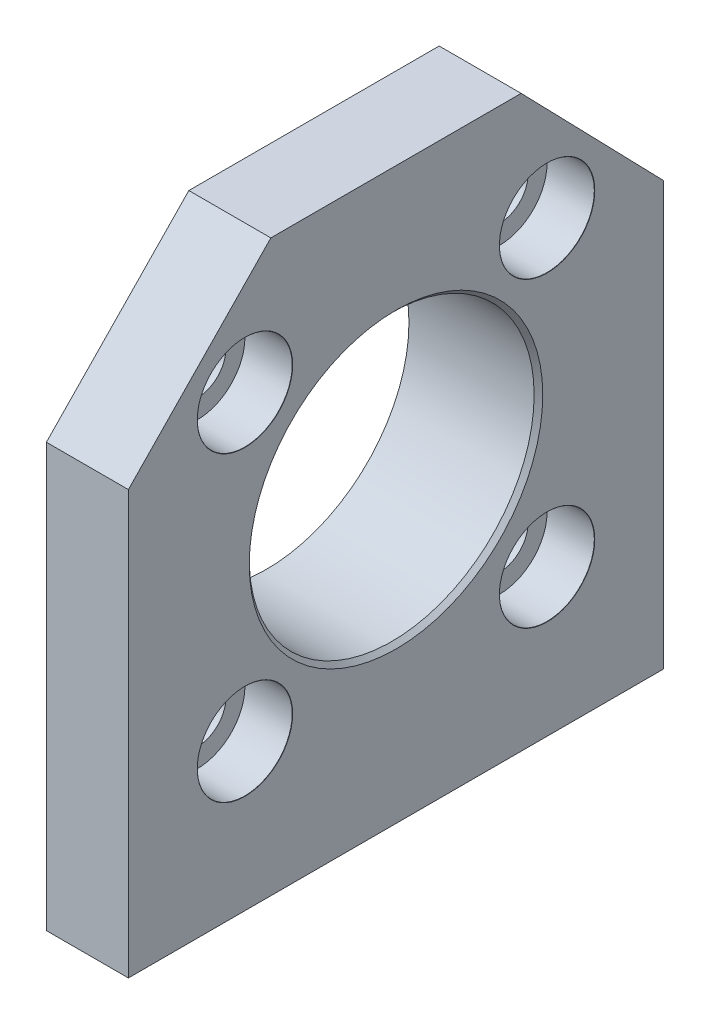
ISO-10303-21;
HEADER;
FILE_DESCRIPTION(('STEP AP214'),'2;1');
FILE_NAME('part.step','',(''),(''),'','','');
FILE_SCHEMA(('AUTOMOTIVE_DESIGN { 1 0 10303 214 1 1 1 1 }'));
ENDSEC;
DATA;
#1=APPLICATION_CONTEXT('core data for automotive mechanical design processes');
#2=APPLICATION_PROTOCOL_DEFINITION('international standard','automotive_design',2000,#1);
#3=PRODUCT_CONTEXT('',#1,'mechanical');
#4=PRODUCT('Part','Part','',(#3));
#5=PRODUCT_RELATED_PRODUCT_CATEGORY('part','',(#4));
#6=PRODUCT_DEFINITION_FORMATION('','',#4);
#7=PRODUCT_DEFINITION_CONTEXT('part definition',#1,'design');
#8=PRODUCT_DEFINITION('design','',#6,#7);
#9=PRODUCT_DEFINITION_SHAPE('','',#8);
#10=(LENGTH_UNIT() NAMED_UNIT(*) SI_UNIT(.MILLI.,.METRE.));
#11=(NAMED_UNIT(*) PLANE_ANGLE_UNIT() SI_UNIT($,.RADIAN.));
#12=(NAMED_UNIT(*) SI_UNIT($,.STERADIAN.) SOLID_ANGLE_UNIT());
#13=UNCERTAINTY_MEASURE_WITH_UNIT(LENGTH_MEASURE(1.E-05),#10,'distance_accuracy_value','');
#14=(GEOMETRIC_REPRESENTATION_CONTEXT(3) GLOBAL_UNCERTAINTY_ASSIGNED_CONTEXT((#13)) GLOBAL_UNIT_ASSIGNED_CONTEXT((#10,
#11,#12)) REPRESENTATION_CONTEXT('',''));
#15=CARTESIAN_POINT('',(0.,0.,0.));
#16=DIRECTION('',(0.,0.,1.));
#17=DIRECTION('',(1.,0.,0.));
#18=AXIS2_PLACEMENT_3D('',#15,#16,#17);
#19=CARTESIAN_POINT('',(-9.5,23.7688195991091,24.4890868596882));
#20=DIRECTION('',(0.,-0.69647537716866,-0.717580691628316));
#21=DIRECTION('',(0.,0.717580691628316,-0.69647537716866));
#22=AXIS2_PLACEMENT_3D('',#19,#20,#21);
#23=PLANE('',#22);
#24=DIRECTION('',(0.,0.717580691628316,-0.69647537716866));
#25=VECTOR('',#24,1.);
#26=CARTESIAN_POINT('',(0.,23.7688195991091,24.4890868596882));
#27=LINE('',#26,#25);
#28=CARTESIAN_POINT('',(0.,49.,0.));
#29=VERTEX_POINT('',#28);
#30=CARTESIAN_POINT('',(0.,66.,-16.5));
#31=VERTEX_POINT('',#30);
#32=EDGE_CURVE('E135',#29,#31,#27,.T.);
#33=ORIENTED_EDGE('',*,*,#32,.T.);
#34=DIRECTION('',(1.,0.,0.));
#35=VECTOR('',#34,1.);
#36=CARTESIAN_POINT('',(-9.5,66.,-16.5));
#37=LINE('',#36,#35);
#38=CARTESIAN_POINT('',(-9.5,66.,-16.5));
#39=VERTEX_POINT('',#38);
#40=EDGE_CURVE('E155',#39,#31,#37,.T.);
#41=ORIENTED_EDGE('',*,*,#40,.F.);
#42=DIRECTION('',(0.,0.717580691628316,-0.69647537716866));
#43=VECTOR('',#42,1.);
#44=CARTESIAN_POINT('',(-9.5,23.7688195991091,24.4890868596882));
#45=LINE('',#44,#43);
#46=CARTESIAN_POINT('',(-9.5,49.,0.));
#47=VERTEX_POINT('',#46);
#48=EDGE_CURVE('E154',#47,#39,#45,.T.);
#49=ORIENTED_EDGE('',*,*,#48,.F.);
#50=DIRECTION('',(1.,0.,0.));
#51=VECTOR('',#50,1.);
#52=CARTESIAN_POINT('',(-9.5,49.,0.));
#53=LINE('',#52,#51);
#54=EDGE_CURVE('E134',#47,#29,#53,.T.);
#55=ORIENTED_EDGE('',*,*,#54,.T.);
#56=EDGE_LOOP('',(#33,#41,#49,#55));
#57=FACE_BOUND('',#56,.T.);
#58=ADVANCED_FACE('F43',(#57),#23,.F.);
#59=CARTESIAN_POINT('',(-9.5,66.,0.));
#60=DIRECTION('',(0.,-1.,0.));
#61=DIRECTION('',(0.,0.,-1.));
#62=AXIS2_PLACEMENT_3D('',#59,#60,#61);
#63=PLANE('',#62);
#64=DIRECTION('',(0.,0.,-1.));
#65=VECTOR('',#64,1.);
#66=CARTESIAN_POINT('',(0.,66.,0.));
#67=LINE('',#66,#65);
#68=CARTESIAN_POINT('',(0.,66.,-45.5));
#69=VERTEX_POINT('',#68);
#70=EDGE_CURVE('E82',#31,#69,#67,.T.);
#71=ORIENTED_EDGE('',*,*,#70,.T.);
#72=DIRECTION('',(1.,0.,0.));
#73=VECTOR('',#72,1.);
#74=CARTESIAN_POINT('',(-9.5,66.,-45.5));
#75=LINE('',#74,#73);
#76=CARTESIAN_POINT('',(-9.5,66.,-45.5));
#77=VERTEX_POINT('',#76);
#78=EDGE_CURVE('E121',#77,#69,#75,.T.);
#79=ORIENTED_EDGE('',*,*,#78,.F.);
#80=DIRECTION('',(0.,0.,-1.));
#81=VECTOR('',#80,1.);
#82=CARTESIAN_POINT('',(-9.5,66.,0.));
#83=LINE('',#82,#81);
#84=EDGE_CURVE('E62',#39,#77,#83,.T.);
#85=ORIENTED_EDGE('',*,*,#84,.F.);
#86=ORIENTED_EDGE('',*,*,#40,.T.);
#87=EDGE_LOOP('',(#71,#79,#85,#86));
#88=FACE_BOUND('',#87,.T.);
#89=ADVANCED_FACE('F187',(#88),#63,.F.);
#90=CARTESIAN_POINT('',(-9.5,54.7550111358575,-56.4142538975501));
#91=DIRECTION('',(0.,-0.69647537716866,0.717580691628316));
#92=DIRECTION('',(0.,-0.717580691628316,-0.69647537716866));
#93=AXIS2_PLACEMENT_3D('',#90,#91,#92);
#94=PLANE('',#93);
#95=DIRECTION('',(0.,-0.717580691628316,-0.69647537716866));
#96=VECTOR('',#95,1.);
#97=CARTESIAN_POINT('',(0.,54.7550111358575,-56.4142538975501));
#98=LINE('',#97,#96);
#99=CARTESIAN_POINT('',(0.,49.,-62.));
#100=VERTEX_POINT('',#99);
#101=EDGE_CURVE('E116',#69,#100,#98,.T.);
#102=ORIENTED_EDGE('',*,*,#101,.T.);
#103=DIRECTION('',(1.,0.,0.));
#104=VECTOR('',#103,1.);
#105=CARTESIAN_POINT('',(-9.5,49.,-62.));
#106=LINE('',#105,#104);
#107=CARTESIAN_POINT('',(-9.5,49.,-62.));
#108=VERTEX_POINT('',#107);
#109=EDGE_CURVE('E114',#108,#100,#106,.T.);
#110=ORIENTED_EDGE('',*,*,#109,.F.);
#111=DIRECTION('',(0.,-0.717580691628316,-0.69647537716866));
#112=VECTOR('',#111,1.);
#113=CARTESIAN_POINT('',(-9.5,54.7550111358575,-56.4142538975501));
#114=LINE('',#113,#112);
#115=EDGE_CURVE('E104',#77,#108,#114,.T.);
#116=ORIENTED_EDGE('',*,*,#115,.F.);
#117=ORIENTED_EDGE('',*,*,#78,.T.);
#118=EDGE_LOOP('',(#102,#110,#116,#117));
#119=FACE_BOUND('',#118,.T.);
#120=ADVANCED_FACE('F115',(#119),#94,.F.);
#121=CARTESIAN_POINT('',(-9.5,0.,-62.));
#122=DIRECTION('',(0.,0.,-1.));
#123=DIRECTION('',(-1.,0.,0.));
#124=AXIS2_PLACEMENT_3D('',#121,#122,#123);
#125=PLANE('',#124);
#126=DIRECTION('',(0.,1.,0.));
#127=VECTOR('',#126,1.);
#128=CARTESIAN_POINT('',(0.,0.,-62.));
#129=LINE('',#128,#127);
#130=CARTESIAN_POINT('',(0.,0.,-62.));
#131=VERTEX_POINT('',#130);
#132=EDGE_CURVE('E147',#131,#100,#129,.T.);
#133=ORIENTED_EDGE('',*,*,#132,.F.);
#134=DIRECTION('',(1.,0.,0.));
#135=VECTOR('',#134,1.);
#136=CARTESIAN_POINT('',(-9.5,0.,-62.));
#137=LINE('',#136,#135);
#138=CARTESIAN_POINT('',(-9.5,0.,-62.));
#139=VERTEX_POINT('',#138);
#140=EDGE_CURVE('E122',#139,#131,#137,.T.);
#141=ORIENTED_EDGE('',*,*,#140,.F.);
#142=DIRECTION('',(0.,1.,0.));
#143=VECTOR('',#142,1.);
#144=CARTESIAN_POINT('',(-9.5,0.,-62.));
#145=LINE('',#144,#143);
#146=EDGE_CURVE('E108',#139,#108,#145,.T.);
#147=ORIENTED_EDGE('',*,*,#146,.T.);
#148=ORIENTED_EDGE('',*,*,#109,.T.);
#149=EDGE_LOOP('',(#133,#141,#147,#148));
#150=FACE_BOUND('',#149,.T.);
#151=ADVANCED_FACE('F124',(#150),#125,.T.);
#152=CARTESIAN_POINT('',(-9.5,0.,0.));
#153=DIRECTION('',(0.,-1.,0.));
#154=DIRECTION('',(0.,0.,-1.));
#155=AXIS2_PLACEMENT_3D('',#152,#153,#154);
#156=PLANE('',#155);
#157=DIRECTION('',(0.,0.,-1.));
#158=VECTOR('',#157,1.);
#159=CARTESIAN_POINT('',(0.,0.,0.));
#160=LINE('',#159,#158);
#161=CARTESIAN_POINT('',(0.,0.,0.));
#162=VERTEX_POINT('',#161);
#163=EDGE_CURVE('E143',#162,#131,#160,.T.);
#164=ORIENTED_EDGE('',*,*,#163,.F.);
#165=DIRECTION('',(1.,0.,0.));
#166=VECTOR('',#165,1.);
#167=CARTESIAN_POINT('',(-9.5,0.,0.));
#168=LINE('',#167,#166);
#169=CARTESIAN_POINT('',(-9.5,0.,0.));
#170=VERTEX_POINT('',#169);
#171=EDGE_CURVE('E163',#170,#162,#168,.T.);
#172=ORIENTED_EDGE('',*,*,#171,.F.);
#173=DIRECTION('',(0.,0.,-1.));
#174=VECTOR('',#173,1.);
#175=CARTESIAN_POINT('',(-9.5,0.,0.));
#176=LINE('',#175,#174);
#177=EDGE_CURVE('E126',#170,#139,#176,.T.);
#178=ORIENTED_EDGE('',*,*,#177,.T.);
#179=ORIENTED_EDGE('',*,*,#140,.T.);
#180=EDGE_LOOP('',(#164,#172,#178,#179));
#181=FACE_BOUND('',#180,.T.);
#182=ADVANCED_FACE('F197',(#181),#156,.T.);
#183=CARTESIAN_POINT('',(-9.5,0.,0.));
#184=DIRECTION('',(0.,0.,-1.));
#185=DIRECTION('',(-1.,0.,0.));
#186=AXIS2_PLACEMENT_3D('',#183,#184,#185);
#187=PLANE('',#186);
#188=DIRECTION('',(0.,1.,0.));
#189=VECTOR('',#188,1.);
#190=CARTESIAN_POINT('',(0.,0.,0.));
#191=LINE('',#190,#189);
#192=EDGE_CURVE('E139',#162,#29,#191,.T.);
#193=ORIENTED_EDGE('',*,*,#192,.T.);
#194=ORIENTED_EDGE('',*,*,#54,.F.);
#195=DIRECTION('',(0.,1.,0.));
#196=VECTOR('',#195,1.);
#197=CARTESIAN_POINT('',(-9.5,0.,0.));
#198=LINE('',#197,#196);
#199=EDGE_CURVE('E94',#170,#47,#198,.T.);
#200=ORIENTED_EDGE('',*,*,#199,.F.);
#201=ORIENTED_EDGE('',*,*,#171,.T.);
#202=EDGE_LOOP('',(#193,#194,#200,#201));
#203=FACE_BOUND('',#202,.T.);
#204=ADVANCED_FACE('F194',(#203),#187,.F.);
#205=CARTESIAN_POINT('',(-9.5,0.,0.));
#206=DIRECTION('',(1.,0.,0.));
#207=DIRECTION('',(0.,0.,-1.));
#208=AXIS2_PLACEMENT_3D('',#205,#206,#207);
#209=PLANE('',#208);
#210=CARTESIAN_POINT('',(-9.5,34.5,-31.));
#211=DIRECTION('',(1.,0.,0.));
#212=DIRECTION('',(0.,0.,-1.));
#213=AXIS2_PLACEMENT_3D('',#210,#211,#212);
#214=CIRCLE('',#213,19.9);
#215=CARTESIAN_POINT('',(-9.5,34.5,-50.9));
#216=VERTEX_POINT('',#215);
#217=EDGE_CURVE('E158',#216,#216,#214,.F.);
#218=ORIENTED_EDGE('',*,*,#217,.F.);
#219=EDGE_LOOP('',(#218));
#220=FACE_BOUND('',#219,.T.);
#221=CARTESIAN_POINT('',(-9.49999999999999,52.,-13.5));
#222=DIRECTION('',(1.,0.,0.));
#223=DIRECTION('',(0.,0.,-1.));
#224=AXIS2_PLACEMENT_3D('',#221,#222,#223);
#225=CIRCLE('',#224,3.3);
#226=CARTESIAN_POINT('',(-9.49999999999999,52.,-16.8));
#227=VERTEX_POINT('',#226);
#228=EDGE_CURVE('E313',#227,#227,#225,.T.);
#229=ORIENTED_EDGE('',*,*,#228,.T.);
#230=EDGE_LOOP('',(#229));
#231=FACE_BOUND('',#230,.T.);
#232=CARTESIAN_POINT('',(-9.49999999999999,52.,-48.5));
#233=DIRECTION('',(1.,0.,0.));
#234=DIRECTION('',(0.,0.,-1.));
#235=AXIS2_PLACEMENT_3D('',#232,#233,#234);
#236=CIRCLE('',#235,3.3);
#237=CARTESIAN_POINT('',(-9.49999999999999,52.,-51.8));
#238=VERTEX_POINT('',#237);
#239=EDGE_CURVE('E333',#238,#238,#236,.T.);
#240=ORIENTED_EDGE('',*,*,#239,.T.);
#241=EDGE_LOOP('',(#240));
#242=FACE_BOUND('',#241,.T.);
#243=CARTESIAN_POINT('',(-9.49999999999999,17.,-48.5));
#244=DIRECTION('',(1.,0.,0.));
#245=DIRECTION('',(0.,0.,-1.));
#246=AXIS2_PLACEMENT_3D('',#243,#244,#245);
#247=CIRCLE('',#246,3.30000000000001);
#248=CARTESIAN_POINT('',(-9.49999999999999,17.,-51.8));
#249=VERTEX_POINT('',#248);
#250=EDGE_CURVE('E353',#249,#249,#247,.T.);
#251=ORIENTED_EDGE('',*,*,#250,.T.);
#252=EDGE_LOOP('',(#251));
#253=FACE_BOUND('',#252,.T.);
#254=CARTESIAN_POINT('',(-9.49999999999999,17.,-13.5));
#255=DIRECTION('',(1.,0.,0.));
#256=DIRECTION('',(0.,0.,-1.));
#257=AXIS2_PLACEMENT_3D('',#254,#255,#256);
#258=CIRCLE('',#257,3.30000000000001);
#259=CARTESIAN_POINT('',(-9.49999999999999,17.,-16.8));
#260=VERTEX_POINT('',#259);
#261=EDGE_CURVE('E140',#260,#260,#258,.T.);
#262=ORIENTED_EDGE('',*,*,#261,.T.);
#263=EDGE_LOOP('',(#262));
#264=FACE_BOUND('',#263,.T.);
#265=ORIENTED_EDGE('',*,*,#48,.T.);
#266=ORIENTED_EDGE('',*,*,#84,.T.);
#267=ORIENTED_EDGE('',*,*,#115,.T.);
#268=ORIENTED_EDGE('',*,*,#146,.F.);
#269=ORIENTED_EDGE('',*,*,#177,.F.);
#270=ORIENTED_EDGE('',*,*,#199,.T.);
#271=EDGE_LOOP('',(#265,#266,#267,#268,#269,#270));
#272=FACE_BOUND('',#271,.T.);
#273=ADVANCED_FACE('F106',(#220,#231,#242,#253,#264,#272),#209,.F.);
#274=CARTESIAN_POINT('',(0.,0.,0.));
#275=DIRECTION('',(1.,0.,0.));
#276=DIRECTION('',(0.,0.,-1.));
#277=AXIS2_PLACEMENT_3D('',#274,#275,#276);
#278=PLANE('',#277);
#279=CARTESIAN_POINT('',(0.,34.5,-31.));
#280=DIRECTION('',(1.,0.,0.));
#281=DIRECTION('',(0.,0.,-1.));
#282=AXIS2_PLACEMENT_3D('',#279,#280,#281);
#283=CIRCLE('',#282,17.);
#284=CARTESIAN_POINT('',(0.,34.5,-48.));
#285=VERTEX_POINT('',#284);
#286=EDGE_CURVE('E11',#285,#285,#283,.F.);
#287=ORIENTED_EDGE('',*,*,#286,.T.);
#288=EDGE_LOOP('',(#287));
#289=FACE_BOUND('',#288,.T.);
#290=CARTESIAN_POINT('',(0.,52.,-13.5));
#291=DIRECTION('',(1.,0.,0.));
#292=DIRECTION('',(0.,0.,-1.));
#293=AXIS2_PLACEMENT_3D('',#290,#291,#292);
#294=CIRCLE('',#293,5.525);
#295=CARTESIAN_POINT('',(0.,52.,-19.025));
#296=VERTEX_POINT('',#295);
#297=EDGE_CURVE('E293',#296,#296,#294,.T.);
#298=ORIENTED_EDGE('',*,*,#297,.F.);
#299=EDGE_LOOP('',(#298));
#300=FACE_BOUND('',#299,.T.);
#301=CARTESIAN_POINT('',(0.,52.,-48.5));
#302=DIRECTION('',(1.,0.,0.));
#303=DIRECTION('',(0.,0.,-1.));
#304=AXIS2_PLACEMENT_3D('',#301,#302,#303);
#305=CIRCLE('',#304,5.525);
#306=CARTESIAN_POINT('',(0.,52.,-54.025));
#307=VERTEX_POINT('',#306);
#308=EDGE_CURVE('E317',#307,#307,#305,.T.);
#309=ORIENTED_EDGE('',*,*,#308,.F.);
#310=EDGE_LOOP('',(#309));
#311=FACE_BOUND('',#310,.T.);
#312=CARTESIAN_POINT('',(0.,17.,-48.5));
#313=DIRECTION('',(1.,0.,0.));
#314=DIRECTION('',(0.,0.,-1.));
#315=AXIS2_PLACEMENT_3D('',#312,#313,#314);
#316=CIRCLE('',#315,5.525);
#317=CARTESIAN_POINT('',(0.,17.,-54.025));
#318=VERTEX_POINT('',#317);
#319=EDGE_CURVE('E337',#318,#318,#316,.T.);
#320=ORIENTED_EDGE('',*,*,#319,.F.);
#321=EDGE_LOOP('',(#320));
#322=FACE_BOUND('',#321,.T.);
#323=CARTESIAN_POINT('',(0.,17.,-13.5));
#324=DIRECTION('',(1.,0.,0.));
#325=DIRECTION('',(0.,0.,-1.));
#326=AXIS2_PLACEMENT_3D('',#323,#324,#325);
#327=CIRCLE('',#326,5.525);
#328=CARTESIAN_POINT('',(0.,17.,-19.025));
#329=VERTEX_POINT('',#328);
#330=EDGE_CURVE('E357',#329,#329,#327,.T.);
#331=ORIENTED_EDGE('',*,*,#330,.F.);
#332=EDGE_LOOP('',(#331));
#333=FACE_BOUND('',#332,.T.);
#334=ORIENTED_EDGE('',*,*,#32,.F.);
#335=ORIENTED_EDGE('',*,*,#192,.F.);
#336=ORIENTED_EDGE('',*,*,#163,.T.);
#337=ORIENTED_EDGE('',*,*,#132,.T.);
#338=ORIENTED_EDGE('',*,*,#101,.F.);
#339=ORIENTED_EDGE('',*,*,#70,.F.);
#340=EDGE_LOOP('',(#334,#335,#336,#337,#338,#339));
#341=FACE_BOUND('',#340,.T.);
#342=ADVANCED_FACE('F206',(#289,#300,#311,#322,#333,#341),#278,.T.);
#343=CARTESIAN_POINT('',(0.,17.,-13.5));
#344=DIRECTION('',(1.,0.,0.));
#345=DIRECTION('',(0.,0.,-1.));
#346=AXIS2_PLACEMENT_3D('',#343,#344,#345);
#347=CYLINDRICAL_SURFACE('',#346,3.3);
#348=ORIENTED_EDGE('',*,*,#261,.F.);
#349=EDGE_LOOP('',(#348));
#350=FACE_BOUND('',#349,.T.);
#351=CARTESIAN_POINT('',(-5.5,17.,-13.5));
#352=DIRECTION('',(1.,0.,0.));
#353=DIRECTION('',(0.,0.,-1.));
#354=AXIS2_PLACEMENT_3D('',#351,#352,#353);
#355=CIRCLE('',#354,3.3);
#356=CARTESIAN_POINT('',(-5.5,17.,-16.8));
#357=VERTEX_POINT('',#356);
#358=EDGE_CURVE('E369',#357,#357,#355,.T.);
#359=ORIENTED_EDGE('',*,*,#358,.T.);
#360=EDGE_LOOP('',(#359));
#361=FACE_BOUND('',#360,.T.);
#362=ADVANCED_FACE('F209',(#350,#361),#347,.F.);
#363=CARTESIAN_POINT('',(-5.5,22.5,-13.5));
#364=DIRECTION('',(-1.,0.,0.));
#365=DIRECTION('',(0.,0.,1.));
#366=AXIS2_PLACEMENT_3D('',#363,#364,#365);
#367=PLANE('',#366);
#368=ORIENTED_EDGE('',*,*,#358,.F.);
#369=EDGE_LOOP('',(#368));
#370=FACE_BOUND('',#369,.T.);
#371=CARTESIAN_POINT('',(-5.5,17.,-13.5));
#372=DIRECTION('',(1.,0.,0.));
#373=DIRECTION('',(0.,0.,-1.));
#374=AXIS2_PLACEMENT_3D('',#371,#372,#373);
#375=CIRCLE('',#374,5.5);
#376=CARTESIAN_POINT('',(-5.5,17.,-19.));
#377=VERTEX_POINT('',#376);
#378=EDGE_CURVE('E365',#377,#377,#375,.T.);
#379=ORIENTED_EDGE('',*,*,#378,.T.);
#380=EDGE_LOOP('',(#379));
#381=FACE_BOUND('',#380,.T.);
#382=ADVANCED_FACE('F216',(#370,#381),#367,.F.);
#383=CARTESIAN_POINT('',(0.,17.,-13.5));
#384=DIRECTION('',(1.,0.,0.));
#385=DIRECTION('',(0.,0.,-1.));
#386=AXIS2_PLACEMENT_3D('',#383,#384,#385);
#387=CYLINDRICAL_SURFACE('',#386,5.5);
#388=ORIENTED_EDGE('',*,*,#378,.F.);
#389=EDGE_LOOP('',(#388));
#390=FACE_BOUND('',#389,.T.);
#391=CARTESIAN_POINT('',(-0.0250000000000033,17.,-13.5));
#392=DIRECTION('',(1.,0.,0.));
#393=DIRECTION('',(0.,0.,-1.));
#394=AXIS2_PLACEMENT_3D('',#391,#392,#393);
#395=CIRCLE('',#394,5.5);
#396=CARTESIAN_POINT('',(-0.0250000000000033,17.,-19.));
#397=VERTEX_POINT('',#396);
#398=EDGE_CURVE('E361',#397,#397,#395,.T.);
#399=ORIENTED_EDGE('',*,*,#398,.T.);
#400=EDGE_LOOP('',(#399));
#401=FACE_BOUND('',#400,.T.);
#402=ADVANCED_FACE('F220',(#390,#401),#387,.F.);
#403=CARTESIAN_POINT('',(0.,17.,-13.5));
#404=DIRECTION('',(1.,0.,0.));
#405=DIRECTION('',(0.,0.,-1.));
#406=AXIS2_PLACEMENT_3D('',#403,#404,#405);
#407=CONICAL_SURFACE('',#406,5.525,0.785398163397466);
#408=ORIENTED_EDGE('',*,*,#398,.F.);
#409=EDGE_LOOP('',(#408));
#410=FACE_BOUND('',#409,.T.);
#411=ORIENTED_EDGE('',*,*,#330,.T.);
#412=EDGE_LOOP('',(#411));
#413=FACE_BOUND('',#412,.T.);
#414=ADVANCED_FACE('F224',(#410,#413),#407,.F.);
#415=CARTESIAN_POINT('',(0.,17.,-48.5));
#416=DIRECTION('',(1.,0.,0.));
#417=DIRECTION('',(0.,0.,-1.));
#418=AXIS2_PLACEMENT_3D('',#415,#416,#417);
#419=CYLINDRICAL_SURFACE('',#418,3.3);
#420=ORIENTED_EDGE('',*,*,#250,.F.);
#421=EDGE_LOOP('',(#420));
#422=FACE_BOUND('',#421,.T.);
#423=CARTESIAN_POINT('',(-5.5,17.,-48.5));
#424=DIRECTION('',(1.,0.,0.));
#425=DIRECTION('',(0.,0.,-1.));
#426=AXIS2_PLACEMENT_3D('',#423,#424,#425);
#427=CIRCLE('',#426,3.3);
#428=CARTESIAN_POINT('',(-5.5,17.,-51.8));
#429=VERTEX_POINT('',#428);
#430=EDGE_CURVE('E349',#429,#429,#427,.T.);
#431=ORIENTED_EDGE('',*,*,#430,.T.);
#432=EDGE_LOOP('',(#431));
#433=FACE_BOUND('',#432,.T.);
#434=ADVANCED_FACE('F228',(#422,#433),#419,.F.);
#435=CARTESIAN_POINT('',(-5.5,22.5,-48.5));
#436=DIRECTION('',(-1.,0.,0.));
#437=DIRECTION('',(0.,0.,1.));
#438=AXIS2_PLACEMENT_3D('',#435,#436,#437);
#439=PLANE('',#438);
#440=ORIENTED_EDGE('',*,*,#430,.F.);
#441=EDGE_LOOP('',(#440));
#442=FACE_BOUND('',#441,.T.);
#443=CARTESIAN_POINT('',(-5.5,17.,-48.5));
#444=DIRECTION('',(1.,0.,0.));
#445=DIRECTION('',(0.,0.,-1.));
#446=AXIS2_PLACEMENT_3D('',#443,#444,#445);
#447=CIRCLE('',#446,5.5);
#448=CARTESIAN_POINT('',(-5.5,17.,-54.));
#449=VERTEX_POINT('',#448);
#450=EDGE_CURVE('E345',#449,#449,#447,.T.);
#451=ORIENTED_EDGE('',*,*,#450,.T.);
#452=EDGE_LOOP('',(#451));
#453=FACE_BOUND('',#452,.T.);
#454=ADVANCED_FACE('F232',(#442,#453),#439,.F.);
#455=CARTESIAN_POINT('',(0.,17.,-48.5));
#456=DIRECTION('',(1.,0.,0.));
#457=DIRECTION('',(0.,0.,-1.));
#458=AXIS2_PLACEMENT_3D('',#455,#456,#457);
#459=CYLINDRICAL_SURFACE('',#458,5.5);
#460=ORIENTED_EDGE('',*,*,#450,.F.);
#461=EDGE_LOOP('',(#460));
#462=FACE_BOUND('',#461,.T.);
#463=CARTESIAN_POINT('',(-0.0250000000000033,17.,-48.5));
#464=DIRECTION('',(1.,0.,0.));
#465=DIRECTION('',(0.,0.,-1.));
#466=AXIS2_PLACEMENT_3D('',#463,#464,#465);
#467=CIRCLE('',#466,5.5);
#468=CARTESIAN_POINT('',(-0.0250000000000033,17.,-54.));
#469=VERTEX_POINT('',#468);
#470=EDGE_CURVE('E341',#469,#469,#467,.T.);
#471=ORIENTED_EDGE('',*,*,#470,.T.);
#472=EDGE_LOOP('',(#471));
#473=FACE_BOUND('',#472,.T.);
#474=ADVANCED_FACE('F236',(#462,#473),#459,.F.);
#475=CARTESIAN_POINT('',(0.,17.,-48.5));
#476=DIRECTION('',(1.,0.,0.));
#477=DIRECTION('',(0.,0.,-1.));
#478=AXIS2_PLACEMENT_3D('',#475,#476,#477);
#479=CONICAL_SURFACE('',#478,5.525,0.785398163397466);
#480=ORIENTED_EDGE('',*,*,#470,.F.);
#481=EDGE_LOOP('',(#480));
#482=FACE_BOUND('',#481,.T.);
#483=ORIENTED_EDGE('',*,*,#319,.T.);
#484=EDGE_LOOP('',(#483));
#485=FACE_BOUND('',#484,.T.);
#486=ADVANCED_FACE('F240',(#482,#485),#479,.F.);
#487=CARTESIAN_POINT('',(0.,52.,-48.5));
#488=DIRECTION('',(1.,0.,0.));
#489=DIRECTION('',(0.,0.,-1.));
#490=AXIS2_PLACEMENT_3D('',#487,#488,#489);
#491=CYLINDRICAL_SURFACE('',#490,3.3);
#492=ORIENTED_EDGE('',*,*,#239,.F.);
#493=EDGE_LOOP('',(#492));
#494=FACE_BOUND('',#493,.T.);
#495=CARTESIAN_POINT('',(-5.5,52.,-48.5));
#496=DIRECTION('',(1.,0.,0.));
#497=DIRECTION('',(0.,0.,-1.));
#498=AXIS2_PLACEMENT_3D('',#495,#496,#497);
#499=CIRCLE('',#498,3.3);
#500=CARTESIAN_POINT('',(-5.5,52.,-51.8));
#501=VERTEX_POINT('',#500);
#502=EDGE_CURVE('E329',#501,#501,#499,.T.);
#503=ORIENTED_EDGE('',*,*,#502,.T.);
#504=EDGE_LOOP('',(#503));
#505=FACE_BOUND('',#504,.T.);
#506=ADVANCED_FACE('F244',(#494,#505),#491,.F.);
#507=CARTESIAN_POINT('',(-5.5,57.5,-48.5));
#508=DIRECTION('',(-1.,0.,0.));
#509=DIRECTION('',(0.,0.,1.));
#510=AXIS2_PLACEMENT_3D('',#507,#508,#509);
#511=PLANE('',#510);
#512=ORIENTED_EDGE('',*,*,#502,.F.);
#513=EDGE_LOOP('',(#512));
#514=FACE_BOUND('',#513,.T.);
#515=CARTESIAN_POINT('',(-5.5,52.,-48.5));
#516=DIRECTION('',(1.,0.,0.));
#517=DIRECTION('',(0.,0.,-1.));
#518=AXIS2_PLACEMENT_3D('',#515,#516,#517);
#519=CIRCLE('',#518,5.5);
#520=CARTESIAN_POINT('',(-5.5,52.,-54.));
#521=VERTEX_POINT('',#520);
#522=EDGE_CURVE('E325',#521,#521,#519,.T.);
#523=ORIENTED_EDGE('',*,*,#522,.T.);
#524=EDGE_LOOP('',(#523));
#525=FACE_BOUND('',#524,.T.);
#526=ADVANCED_FACE('F248',(#514,#525),#511,.F.);
#527=CARTESIAN_POINT('',(0.,52.,-48.5));
#528=DIRECTION('',(1.,0.,0.));
#529=DIRECTION('',(0.,0.,-1.));
#530=AXIS2_PLACEMENT_3D('',#527,#528,#529);
#531=CYLINDRICAL_SURFACE('',#530,5.5);
#532=ORIENTED_EDGE('',*,*,#522,.F.);
#533=EDGE_LOOP('',(#532));
#534=FACE_BOUND('',#533,.T.);
#535=CARTESIAN_POINT('',(-0.0250000000000033,52.,-48.5));
#536=DIRECTION('',(1.,0.,0.));
#537=DIRECTION('',(0.,0.,-1.));
#538=AXIS2_PLACEMENT_3D('',#535,#536,#537);
#539=CIRCLE('',#538,5.5);
#540=CARTESIAN_POINT('',(-0.0250000000000033,52.,-54.));
#541=VERTEX_POINT('',#540);
#542=EDGE_CURVE('E321',#541,#541,#539,.T.);
#543=ORIENTED_EDGE('',*,*,#542,.T.);
#544=EDGE_LOOP('',(#543));
#545=FACE_BOUND('',#544,.T.);
#546=ADVANCED_FACE('F252',(#534,#545),#531,.F.);
#547=CARTESIAN_POINT('',(0.,52.,-48.5));
#548=DIRECTION('',(1.,0.,0.));
#549=DIRECTION('',(0.,0.,-1.));
#550=AXIS2_PLACEMENT_3D('',#547,#548,#549);
#551=CONICAL_SURFACE('',#550,5.525,0.785398163397466);
#552=ORIENTED_EDGE('',*,*,#542,.F.);
#553=EDGE_LOOP('',(#552));
#554=FACE_BOUND('',#553,.T.);
#555=ORIENTED_EDGE('',*,*,#308,.T.);
#556=EDGE_LOOP('',(#555));
#557=FACE_BOUND('',#556,.T.);
#558=ADVANCED_FACE('F256',(#554,#557),#551,.F.);
#559=CARTESIAN_POINT('',(0.,52.,-13.5));
#560=DIRECTION('',(1.,0.,0.));
#561=DIRECTION('',(0.,0.,-1.));
#562=AXIS2_PLACEMENT_3D('',#559,#560,#561);
#563=CYLINDRICAL_SURFACE('',#562,3.3);
#564=ORIENTED_EDGE('',*,*,#228,.F.);
#565=EDGE_LOOP('',(#564));
#566=FACE_BOUND('',#565,.T.);
#567=CARTESIAN_POINT('',(-5.5,52.,-13.5));
#568=DIRECTION('',(1.,0.,0.));
#569=DIRECTION('',(0.,0.,-1.));
#570=AXIS2_PLACEMENT_3D('',#567,#568,#569);
#571=CIRCLE('',#570,3.3);
#572=CARTESIAN_POINT('',(-5.5,52.,-16.8));
#573=VERTEX_POINT('',#572);
#574=EDGE_CURVE('E309',#573,#573,#571,.T.);
#575=ORIENTED_EDGE('',*,*,#574,.T.);
#576=EDGE_LOOP('',(#575));
#577=FACE_BOUND('',#576,.T.);
#578=ADVANCED_FACE('F260',(#566,#577),#563,.F.);
#579=CARTESIAN_POINT('',(-5.5,57.5,-13.5));
#580=DIRECTION('',(-1.,0.,0.));
#581=DIRECTION('',(0.,0.,1.));
#582=AXIS2_PLACEMENT_3D('',#579,#580,#581);
#583=PLANE('',#582);
#584=ORIENTED_EDGE('',*,*,#574,.F.);
#585=EDGE_LOOP('',(#584));
#586=FACE_BOUND('',#585,.T.);
#587=CARTESIAN_POINT('',(-5.5,52.,-13.5));
#588=DIRECTION('',(1.,0.,0.));
#589=DIRECTION('',(0.,0.,-1.));
#590=AXIS2_PLACEMENT_3D('',#587,#588,#589);
#591=CIRCLE('',#590,5.5);
#592=CARTESIAN_POINT('',(-5.5,52.,-19.));
#593=VERTEX_POINT('',#592);
#594=EDGE_CURVE('E305',#593,#593,#591,.T.);
#595=ORIENTED_EDGE('',*,*,#594,.T.);
#596=EDGE_LOOP('',(#595));
#597=FACE_BOUND('',#596,.T.);
#598=ADVANCED_FACE('F264',(#586,#597),#583,.F.);
#599=CARTESIAN_POINT('',(0.,52.,-13.5));
#600=DIRECTION('',(1.,0.,0.));
#601=DIRECTION('',(0.,0.,-1.));
#602=AXIS2_PLACEMENT_3D('',#599,#600,#601);
#603=CYLINDRICAL_SURFACE('',#602,5.5);
#604=ORIENTED_EDGE('',*,*,#594,.F.);
#605=EDGE_LOOP('',(#604));
#606=FACE_BOUND('',#605,.T.);
#607=CARTESIAN_POINT('',(-0.0250000000000033,52.,-13.5));
#608=DIRECTION('',(1.,0.,0.));
#609=DIRECTION('',(0.,0.,-1.));
#610=AXIS2_PLACEMENT_3D('',#607,#608,#609);
#611=CIRCLE('',#610,5.5);
#612=CARTESIAN_POINT('',(-0.0250000000000033,52.,-19.));
#613=VERTEX_POINT('',#612);
#614=EDGE_CURVE('E298',#613,#613,#611,.T.);
#615=ORIENTED_EDGE('',*,*,#614,.T.);
#616=EDGE_LOOP('',(#615));
#617=FACE_BOUND('',#616,.T.);
#618=ADVANCED_FACE('F268',(#606,#617),#603,.F.);
#619=CARTESIAN_POINT('',(0.,52.,-13.5));
#620=DIRECTION('',(1.,0.,0.));
#621=DIRECTION('',(0.,0.,-1.));
#622=AXIS2_PLACEMENT_3D('',#619,#620,#621);
#623=CONICAL_SURFACE('',#622,5.525,0.785398163397466);
#624=ORIENTED_EDGE('',*,*,#614,.F.);
#625=EDGE_LOOP('',(#624));
#626=FACE_BOUND('',#625,.T.);
#627=ORIENTED_EDGE('',*,*,#297,.T.);
#628=EDGE_LOOP('',(#627));
#629=FACE_BOUND('',#628,.T.);
#630=ADVANCED_FACE('F272',(#626,#629),#623,.F.);
#631=CARTESIAN_POINT('',(-15.,34.5,-31.));
#632=DIRECTION('',(1.,0.,0.));
#633=DIRECTION('',(0.,0.,-1.));
#634=AXIS2_PLACEMENT_3D('',#631,#632,#633);
#635=CYLINDRICAL_SURFACE('',#634,19.9);
#636=CARTESIAN_POINT('',(-15.,34.5,-31.));
#637=DIRECTION('',(-1.,0.,0.));
#638=DIRECTION('',(0.,0.,1.));
#639=AXIS2_PLACEMENT_3D('',#636,#637,#638);
#640=CIRCLE('',#639,19.9);
#641=CARTESIAN_POINT('',(-15.,34.5,-11.1));
#642=VERTEX_POINT('',#641);
#643=EDGE_CURVE('E291',#642,#642,#640,.T.);
#644=ORIENTED_EDGE('',*,*,#643,.F.);
#645=EDGE_LOOP('',(#644));
#646=FACE_BOUND('',#645,.T.);
#647=ORIENTED_EDGE('',*,*,#217,.T.);
#648=EDGE_LOOP('',(#647));
#649=FACE_BOUND('',#648,.T.);
#650=ADVANCED_FACE('F276',(#646,#649),#635,.T.);
#651=CARTESIAN_POINT('',(-15.,34.5,-31.));
#652=DIRECTION('',(-1.,0.,0.));
#653=DIRECTION('',(0.,0.,1.));
#654=AXIS2_PLACEMENT_3D('',#651,#652,#653);
#655=PLANE('',#654);
#656=CARTESIAN_POINT('',(-15.,34.5,-31.));
#657=DIRECTION('',(1.,0.,0.));
#658=DIRECTION('',(0.,0.,-1.));
#659=AXIS2_PLACEMENT_3D('',#656,#657,#658);
#660=CIRCLE('',#659,16.5);
#661=CARTESIAN_POINT('',(-15.,34.5,-47.5));
#662=VERTEX_POINT('',#661);
#663=EDGE_CURVE('E288',#662,#662,#660,.T.);
#664=ORIENTED_EDGE('',*,*,#663,.T.);
#665=EDGE_LOOP('',(#664));
#666=FACE_BOUND('',#665,.T.);
#667=ORIENTED_EDGE('',*,*,#643,.T.);
#668=EDGE_LOOP('',(#667));
#669=FACE_BOUND('',#668,.T.);
#670=ADVANCED_FACE('F183',(#666,#669),#655,.T.);
#671=CARTESIAN_POINT('',(-15.,34.5,-31.));
#672=DIRECTION('',(1.,0.,0.));
#673=DIRECTION('',(0.,0.,-1.));
#674=AXIS2_PLACEMENT_3D('',#671,#672,#673);
#675=CYLINDRICAL_SURFACE('',#674,16.5);
#676=CARTESIAN_POINT('',(-0.499999999999987,34.5,-31.));
#677=DIRECTION('',(1.,0.,0.));
#678=DIRECTION('',(0.,0.,-1.));
#679=AXIS2_PLACEMENT_3D('',#676,#677,#678);
#680=CIRCLE('',#679,16.5);
#681=CARTESIAN_POINT('',(-0.499999999999987,34.5,-47.5));
#682=VERTEX_POINT('',#681);
#683=EDGE_CURVE('E54',#682,#682,#680,.T.);
#684=ORIENTED_EDGE('',*,*,#683,.T.);
#685=EDGE_LOOP('',(#684));
#686=FACE_BOUND('',#685,.T.);
#687=ORIENTED_EDGE('',*,*,#663,.F.);
#688=EDGE_LOOP('',(#687));
#689=FACE_BOUND('',#688,.T.);
#690=ADVANCED_FACE('F175',(#686,#689),#675,.F.);
#691=CARTESIAN_POINT('',(-0.499999999999987,34.5,-31.));
#692=DIRECTION('',(1.,0.,0.));
#693=DIRECTION('',(0.,0.,-1.));
#694=AXIS2_PLACEMENT_3D('',#691,#692,#693);
#695=CONICAL_SURFACE('',#694,16.5,0.785398163397462);
#696=ORIENTED_EDGE('',*,*,#286,.F.);
#697=EDGE_LOOP('',(#696));
#698=FACE_BOUND('',#697,.T.);
#699=ORIENTED_EDGE('',*,*,#683,.F.);
#700=EDGE_LOOP('',(#699));
#701=FACE_BOUND('',#700,.T.);
#702=ADVANCED_FACE('F46',(#698,#701),#695,.F.);
#703=CLOSED_SHELL('',(#58,#89,#120,#151,#182,#204,#273,#342,#362,#382,#402,#414,#434,#454,#474,
#486,#506,#526,#546,#558,#578,#598,#618,#630,#650,#670,#690,#702));
#704=MANIFOLD_SOLID_BREP('B2',#703);
#705=ADVANCED_BREP_SHAPE_REPRESENTATION('',(#18,#704),#14);
#706=SHAPE_DEFINITION_REPRESENTATION(#9,#705);
ENDSEC;
END-ISO-10303-21;
